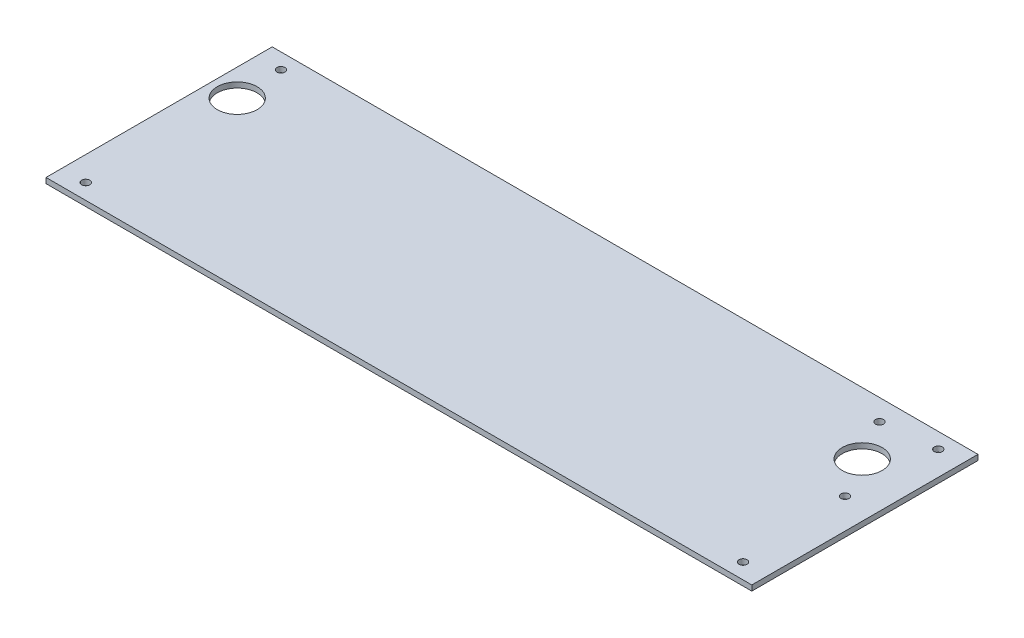
ISO-10303-21;
HEADER;
FILE_DESCRIPTION(('STEP AP214'),'2;1');
FILE_NAME('part.step','',(''),(''),'','','');
FILE_SCHEMA(('AUTOMOTIVE_DESIGN { 1 0 10303 214 1 1 1 1 }'));
ENDSEC;
DATA;
#1=APPLICATION_CONTEXT('core data for automotive mechanical design processes');
#2=APPLICATION_PROTOCOL_DEFINITION('international standard','automotive_design',2000,#1);
#3=PRODUCT_CONTEXT('',#1,'mechanical');
#4=PRODUCT('Part','Part','',(#3));
#5=PRODUCT_RELATED_PRODUCT_CATEGORY('part','',(#4));
#6=PRODUCT_DEFINITION_FORMATION('','',#4);
#7=PRODUCT_DEFINITION_CONTEXT('part definition',#1,'design');
#8=PRODUCT_DEFINITION('design','',#6,#7);
#9=PRODUCT_DEFINITION_SHAPE('','',#8);
#10=(LENGTH_UNIT() NAMED_UNIT(*) SI_UNIT(.MILLI.,.METRE.));
#11=(NAMED_UNIT(*) PLANE_ANGLE_UNIT() SI_UNIT($,.RADIAN.));
#12=(NAMED_UNIT(*) SI_UNIT($,.STERADIAN.) SOLID_ANGLE_UNIT());
#13=UNCERTAINTY_MEASURE_WITH_UNIT(LENGTH_MEASURE(1.E-05),#10,'distance_accuracy_value','');
#14=(GEOMETRIC_REPRESENTATION_CONTEXT(3) GLOBAL_UNCERTAINTY_ASSIGNED_CONTEXT((#13)) GLOBAL_UNIT_ASSIGNED_CONTEXT((#10,
#11,#12)) REPRESENTATION_CONTEXT('',''));
#15=CARTESIAN_POINT('',(0.,0.,0.));
#16=DIRECTION('',(0.,0.,1.));
#17=DIRECTION('',(1.,0.,0.));
#18=AXIS2_PLACEMENT_3D('',#15,#16,#17);
#19=CARTESIAN_POINT('',(-131.05,1.,42.));
#20=DIRECTION('',(1.,0.,0.));
#21=DIRECTION('',(0.,0.,-1.));
#22=AXIS2_PLACEMENT_3D('',#19,#20,#21);
#23=PLANE('',#22);
#24=DIRECTION('',(0.,0.,1.));
#25=VECTOR('',#24,1.);
#26=CARTESIAN_POINT('',(-131.05,-1.,42.));
#27=LINE('',#26,#25);
#28=CARTESIAN_POINT('',(-131.05,-1.,-42.));
#29=VERTEX_POINT('',#28);
#30=CARTESIAN_POINT('',(-131.05,-1.,42.));
#31=VERTEX_POINT('',#30);
#32=EDGE_CURVE('E101',#29,#31,#27,.T.);
#33=ORIENTED_EDGE('',*,*,#32,.T.);
#34=DIRECTION('',(0.,-1.,0.));
#35=VECTOR('',#34,1.);
#36=CARTESIAN_POINT('',(-131.05,1.,42.));
#37=LINE('',#36,#35);
#38=CARTESIAN_POINT('',(-131.05,1.,42.));
#39=VERTEX_POINT('',#38);
#40=EDGE_CURVE('E11',#39,#31,#37,.T.);
#41=ORIENTED_EDGE('',*,*,#40,.F.);
#42=DIRECTION('',(0.,0.,1.));
#43=VECTOR('',#42,1.);
#44=CARTESIAN_POINT('',(-131.05,1.,42.));
#45=LINE('',#44,#43);
#46=CARTESIAN_POINT('',(-131.05,1.,-42.));
#47=VERTEX_POINT('',#46);
#48=EDGE_CURVE('E88',#47,#39,#45,.T.);
#49=ORIENTED_EDGE('',*,*,#48,.F.);
#50=DIRECTION('',(0.,-1.,0.));
#51=VECTOR('',#50,1.);
#52=CARTESIAN_POINT('',(-131.05,1.,-42.));
#53=LINE('',#52,#51);
#54=EDGE_CURVE('E97',#47,#29,#53,.T.);
#55=ORIENTED_EDGE('',*,*,#54,.T.);
#56=EDGE_LOOP('',(#33,#41,#49,#55));
#57=FACE_BOUND('',#56,.T.);
#58=ADVANCED_FACE('F35',(#57),#23,.F.);
#59=CARTESIAN_POINT('',(131.05,1.,42.));
#60=DIRECTION('',(0.,0.,-1.));
#61=DIRECTION('',(-1.,0.,0.));
#62=AXIS2_PLACEMENT_3D('',#59,#60,#61);
#63=PLANE('',#62);
#64=DIRECTION('',(1.,0.,0.));
#65=VECTOR('',#64,1.);
#66=CARTESIAN_POINT('',(131.05,-1.,42.));
#67=LINE('',#66,#65);
#68=CARTESIAN_POINT('',(131.05,-1.,42.));
#69=VERTEX_POINT('',#68);
#70=EDGE_CURVE('E92',#31,#69,#67,.T.);
#71=ORIENTED_EDGE('',*,*,#70,.T.);
#72=DIRECTION('',(0.,-1.,0.));
#73=VECTOR('',#72,1.);
#74=CARTESIAN_POINT('',(131.05,1.,42.));
#75=LINE('',#74,#73);
#76=CARTESIAN_POINT('',(131.05,1.,42.));
#77=VERTEX_POINT('',#76);
#78=EDGE_CURVE('E44',#77,#69,#75,.T.);
#79=ORIENTED_EDGE('',*,*,#78,.F.);
#80=DIRECTION('',(1.,0.,0.));
#81=VECTOR('',#80,1.);
#82=CARTESIAN_POINT('',(131.05,1.,42.));
#83=LINE('',#82,#81);
#84=EDGE_CURVE('E83',#39,#77,#83,.T.);
#85=ORIENTED_EDGE('',*,*,#84,.F.);
#86=ORIENTED_EDGE('',*,*,#40,.T.);
#87=EDGE_LOOP('',(#71,#79,#85,#86));
#88=FACE_BOUND('',#87,.T.);
#89=ADVANCED_FACE('F91',(#88),#63,.F.);
#90=CARTESIAN_POINT('',(131.05,1.,42.));
#91=DIRECTION('',(-1.,0.,0.));
#92=DIRECTION('',(0.,0.,1.));
#93=AXIS2_PLACEMENT_3D('',#90,#91,#92);
#94=PLANE('',#93);
#95=DIRECTION('',(0.,0.,-1.));
#96=VECTOR('',#95,1.);
#97=CARTESIAN_POINT('',(131.05,-1.,42.));
#98=LINE('',#97,#96);
#99=CARTESIAN_POINT('',(131.05,-1.,-42.));
#100=VERTEX_POINT('',#99);
#101=EDGE_CURVE('E70',#69,#100,#98,.T.);
#102=ORIENTED_EDGE('',*,*,#101,.T.);
#103=DIRECTION('',(0.,-1.,0.));
#104=VECTOR('',#103,1.);
#105=CARTESIAN_POINT('',(131.05,1.,-42.));
#106=LINE('',#105,#104);
#107=CARTESIAN_POINT('',(131.05,1.,-42.));
#108=VERTEX_POINT('',#107);
#109=EDGE_CURVE('E93',#108,#100,#106,.T.);
#110=ORIENTED_EDGE('',*,*,#109,.F.);
#111=DIRECTION('',(0.,0.,-1.));
#112=VECTOR('',#111,1.);
#113=CARTESIAN_POINT('',(131.05,1.,42.));
#114=LINE('',#113,#112);
#115=EDGE_CURVE('E86',#77,#108,#114,.T.);
#116=ORIENTED_EDGE('',*,*,#115,.F.);
#117=ORIENTED_EDGE('',*,*,#78,.T.);
#118=EDGE_LOOP('',(#102,#110,#116,#117));
#119=FACE_BOUND('',#118,.T.);
#120=ADVANCED_FACE('F95',(#119),#94,.F.);
#121=CARTESIAN_POINT('',(131.05,1.,-42.));
#122=DIRECTION('',(0.,0.,1.));
#123=DIRECTION('',(1.,0.,0.));
#124=AXIS2_PLACEMENT_3D('',#121,#122,#123);
#125=PLANE('',#124);
#126=DIRECTION('',(-1.,0.,0.));
#127=VECTOR('',#126,1.);
#128=CARTESIAN_POINT('',(131.05,-1.,-42.));
#129=LINE('',#128,#127);
#130=EDGE_CURVE('E76',#100,#29,#129,.T.);
#131=ORIENTED_EDGE('',*,*,#130,.T.);
#132=ORIENTED_EDGE('',*,*,#54,.F.);
#133=DIRECTION('',(-1.,0.,0.));
#134=VECTOR('',#133,1.);
#135=CARTESIAN_POINT('',(131.05,1.,-42.));
#136=LINE('',#135,#134);
#137=EDGE_CURVE('E53',#108,#47,#136,.T.);
#138=ORIENTED_EDGE('',*,*,#137,.F.);
#139=ORIENTED_EDGE('',*,*,#109,.T.);
#140=EDGE_LOOP('',(#131,#132,#138,#139));
#141=FACE_BOUND('',#140,.T.);
#142=ADVANCED_FACE('F164',(#141),#125,.F.);
#143=CARTESIAN_POINT('',(0.,1.,0.));
#144=DIRECTION('',(0.,1.,0.));
#145=DIRECTION('',(0.,0.,1.));
#146=AXIS2_PLACEMENT_3D('',#143,#144,#145);
#147=PLANE('',#146);
#148=CARTESIAN_POINT('',(102.299999873491,1.,-34.1554450383656));
#149=DIRECTION('',(0.,1.,0.));
#150=DIRECTION('',(0.,0.,1.));
#151=AXIS2_PLACEMENT_3D('',#148,#149,#150);
#152=CIRCLE('',#151,1.49999999999992);
#153=CARTESIAN_POINT('',(102.299999873491,1.,-32.6554450383656));
#154=VERTEX_POINT('',#153);
#155=EDGE_CURVE('E123',#154,#154,#152,.T.);
#156=ORIENTED_EDGE('',*,*,#155,.F.);
#157=EDGE_LOOP('',(#156));
#158=FACE_BOUND('',#157,.T.);
#159=CARTESIAN_POINT('',(119.799998237946,1.,-3.8445549616281));
#160=DIRECTION('',(0.,1.,0.));
#161=DIRECTION('',(0.,0.,1.));
#162=AXIS2_PLACEMENT_3D('',#159,#160,#161);
#163=CIRCLE('',#162,1.5);
#164=CARTESIAN_POINT('',(119.799998237946,1.,-2.3445549616281));
#165=VERTEX_POINT('',#164);
#166=EDGE_CURVE('E129',#165,#165,#163,.T.);
#167=ORIENTED_EDGE('',*,*,#166,.F.);
#168=EDGE_LOOP('',(#167));
#169=FACE_BOUND('',#168,.T.);
#170=CARTESIAN_POINT('',(-121.050000944283,1.,-18.9999999999974));
#171=DIRECTION('',(0.,1.,0.));
#172=DIRECTION('',(0.,0.,1.));
#173=AXIS2_PLACEMENT_3D('',#170,#171,#172);
#174=CIRCLE('',#173,7.4);
#175=CARTESIAN_POINT('',(-121.050000944283,1.,-11.5999999999974));
#176=VERTEX_POINT('',#175);
#177=EDGE_CURVE('E140',#176,#176,#174,.T.);
#178=ORIENTED_EDGE('',*,*,#177,.F.);
#179=EDGE_LOOP('',(#178));
#180=FACE_BOUND('',#179,.T.);
#181=CARTESIAN_POINT('',(111.049999055719,1.,-18.9999999999974));
#182=DIRECTION('',(0.,1.,0.));
#183=DIRECTION('',(0.,0.,1.));
#184=AXIS2_PLACEMENT_3D('',#181,#182,#183);
#185=CIRCLE('',#184,7.4);
#186=CARTESIAN_POINT('',(111.049999055719,1.,-11.5999999999974));
#187=VERTEX_POINT('',#186);
#188=EDGE_CURVE('E127',#187,#187,#185,.T.);
#189=ORIENTED_EDGE('',*,*,#188,.F.);
#190=EDGE_LOOP('',(#189));
#191=FACE_BOUND('',#190,.T.);
#192=CARTESIAN_POINT('',(122.05,1.,-36.25));
#193=DIRECTION('',(0.,1.,0.));
#194=DIRECTION('',(0.,0.,1.));
#195=AXIS2_PLACEMENT_3D('',#192,#193,#194);
#196=CIRCLE('',#195,1.5);
#197=CARTESIAN_POINT('',(122.05,1.,-34.75));
#198=VERTEX_POINT('',#197);
#199=EDGE_CURVE('E139',#198,#198,#196,.T.);
#200=ORIENTED_EDGE('',*,*,#199,.F.);
#201=EDGE_LOOP('',(#200));
#202=FACE_BOUND('',#201,.T.);
#203=CARTESIAN_POINT('',(122.05,1.,36.25));
#204=DIRECTION('',(0.,1.,0.));
#205=DIRECTION('',(0.,0.,1.));
#206=AXIS2_PLACEMENT_3D('',#203,#204,#205);
#207=CIRCLE('',#206,1.5);
#208=CARTESIAN_POINT('',(122.05,1.,37.75));
#209=VERTEX_POINT('',#208);
#210=EDGE_CURVE('E151',#209,#209,#207,.T.);
#211=ORIENTED_EDGE('',*,*,#210,.F.);
#212=EDGE_LOOP('',(#211));
#213=FACE_BOUND('',#212,.T.);
#214=CARTESIAN_POINT('',(-122.05,1.,36.25));
#215=DIRECTION('',(0.,1.,0.));
#216=DIRECTION('',(0.,0.,1.));
#217=AXIS2_PLACEMENT_3D('',#214,#215,#216);
#218=CIRCLE('',#217,1.5);
#219=CARTESIAN_POINT('',(-122.05,1.,37.75));
#220=VERTEX_POINT('',#219);
#221=EDGE_CURVE('E148',#220,#220,#218,.T.);
#222=ORIENTED_EDGE('',*,*,#221,.F.);
#223=EDGE_LOOP('',(#222));
#224=FACE_BOUND('',#223,.T.);
#225=CARTESIAN_POINT('',(-122.05,1.,-36.25));
#226=DIRECTION('',(0.,1.,0.));
#227=DIRECTION('',(0.,0.,1.));
#228=AXIS2_PLACEMENT_3D('',#225,#226,#227);
#229=CIRCLE('',#228,1.5);
#230=CARTESIAN_POINT('',(-122.05,1.,-34.75));
#231=VERTEX_POINT('',#230);
#232=EDGE_CURVE('E114',#231,#231,#229,.T.);
#233=ORIENTED_EDGE('',*,*,#232,.F.);
#234=EDGE_LOOP('',(#233));
#235=FACE_BOUND('',#234,.T.);
#236=ORIENTED_EDGE('',*,*,#48,.T.);
#237=ORIENTED_EDGE('',*,*,#84,.T.);
#238=ORIENTED_EDGE('',*,*,#115,.T.);
#239=ORIENTED_EDGE('',*,*,#137,.T.);
#240=EDGE_LOOP('',(#236,#237,#238,#239));
#241=FACE_BOUND('',#240,.T.);
#242=ADVANCED_FACE('F84',(#158,#169,#180,#191,#202,#213,#224,#235,#241),#147,.T.);
#243=CARTESIAN_POINT('',(0.,-1.,0.));
#244=DIRECTION('',(0.,1.,0.));
#245=DIRECTION('',(0.,0.,1.));
#246=AXIS2_PLACEMENT_3D('',#243,#244,#245);
#247=PLANE('',#246);
#248=CARTESIAN_POINT('',(102.299999873491,-1.,-34.1554450383656));
#249=DIRECTION('',(0.,1.,0.));
#250=DIRECTION('',(0.,0.,1.));
#251=AXIS2_PLACEMENT_3D('',#248,#249,#250);
#252=CIRCLE('',#251,1.49999999999992);
#253=CARTESIAN_POINT('',(102.299999873491,-1.,-32.6554450383656));
#254=VERTEX_POINT('',#253);
#255=EDGE_CURVE('E38',#254,#254,#252,.T.);
#256=ORIENTED_EDGE('',*,*,#255,.T.);
#257=EDGE_LOOP('',(#256));
#258=FACE_BOUND('',#257,.T.);
#259=CARTESIAN_POINT('',(119.799998237946,-1.,-3.8445549616281));
#260=DIRECTION('',(0.,1.,0.));
#261=DIRECTION('',(0.,0.,1.));
#262=AXIS2_PLACEMENT_3D('',#259,#260,#261);
#263=CIRCLE('',#262,1.5);
#264=CARTESIAN_POINT('',(119.799998237946,-1.,-2.3445549616281));
#265=VERTEX_POINT('',#264);
#266=EDGE_CURVE('E121',#265,#265,#263,.T.);
#267=ORIENTED_EDGE('',*,*,#266,.T.);
#268=EDGE_LOOP('',(#267));
#269=FACE_BOUND('',#268,.T.);
#270=CARTESIAN_POINT('',(-121.050000944283,-1.,-18.9999999999974));
#271=DIRECTION('',(0.,1.,0.));
#272=DIRECTION('',(0.,0.,1.));
#273=AXIS2_PLACEMENT_3D('',#270,#271,#272);
#274=CIRCLE('',#273,7.4);
#275=CARTESIAN_POINT('',(-121.050000944283,-1.,-11.5999999999974));
#276=VERTEX_POINT('',#275);
#277=EDGE_CURVE('E136',#276,#276,#274,.T.);
#278=ORIENTED_EDGE('',*,*,#277,.T.);
#279=EDGE_LOOP('',(#278));
#280=FACE_BOUND('',#279,.T.);
#281=CARTESIAN_POINT('',(111.049999055719,-1.,-18.9999999999974));
#282=DIRECTION('',(0.,1.,0.));
#283=DIRECTION('',(0.,0.,1.));
#284=AXIS2_PLACEMENT_3D('',#281,#282,#283);
#285=CIRCLE('',#284,7.4);
#286=CARTESIAN_POINT('',(111.049999055719,-1.,-11.5999999999974));
#287=VERTEX_POINT('',#286);
#288=EDGE_CURVE('E143',#287,#287,#285,.T.);
#289=ORIENTED_EDGE('',*,*,#288,.T.);
#290=EDGE_LOOP('',(#289));
#291=FACE_BOUND('',#290,.T.);
#292=CARTESIAN_POINT('',(122.05,-1.,-36.25));
#293=DIRECTION('',(0.,1.,0.));
#294=DIRECTION('',(0.,0.,1.));
#295=AXIS2_PLACEMENT_3D('',#292,#293,#294);
#296=CIRCLE('',#295,1.5);
#297=CARTESIAN_POINT('',(122.05,-1.,-34.75));
#298=VERTEX_POINT('',#297);
#299=EDGE_CURVE('E104',#298,#298,#296,.T.);
#300=ORIENTED_EDGE('',*,*,#299,.T.);
#301=EDGE_LOOP('',(#300));
#302=FACE_BOUND('',#301,.T.);
#303=CARTESIAN_POINT('',(122.05,-1.,36.25));
#304=DIRECTION('',(0.,1.,0.));
#305=DIRECTION('',(0.,0.,1.));
#306=AXIS2_PLACEMENT_3D('',#303,#304,#305);
#307=CIRCLE('',#306,1.5);
#308=CARTESIAN_POINT('',(122.05,-1.,37.75));
#309=VERTEX_POINT('',#308);
#310=EDGE_CURVE('E117',#309,#309,#307,.T.);
#311=ORIENTED_EDGE('',*,*,#310,.T.);
#312=EDGE_LOOP('',(#311));
#313=FACE_BOUND('',#312,.T.);
#314=CARTESIAN_POINT('',(-122.05,-1.,36.25));
#315=DIRECTION('',(0.,1.,0.));
#316=DIRECTION('',(0.,0.,1.));
#317=AXIS2_PLACEMENT_3D('',#314,#315,#316);
#318=CIRCLE('',#317,1.5);
#319=CARTESIAN_POINT('',(-122.05,-1.,37.75));
#320=VERTEX_POINT('',#319);
#321=EDGE_CURVE('E113',#320,#320,#318,.T.);
#322=ORIENTED_EDGE('',*,*,#321,.T.);
#323=EDGE_LOOP('',(#322));
#324=FACE_BOUND('',#323,.T.);
#325=CARTESIAN_POINT('',(-122.05,-1.,-36.25));
#326=DIRECTION('',(0.,1.,0.));
#327=DIRECTION('',(0.,0.,1.));
#328=AXIS2_PLACEMENT_3D('',#325,#326,#327);
#329=CIRCLE('',#328,1.5);
#330=CARTESIAN_POINT('',(-122.05,-1.,-34.75));
#331=VERTEX_POINT('',#330);
#332=EDGE_CURVE('E110',#331,#331,#329,.T.);
#333=ORIENTED_EDGE('',*,*,#332,.T.);
#334=EDGE_LOOP('',(#333));
#335=FACE_BOUND('',#334,.T.);
#336=ORIENTED_EDGE('',*,*,#32,.F.);
#337=ORIENTED_EDGE('',*,*,#130,.F.);
#338=ORIENTED_EDGE('',*,*,#101,.F.);
#339=ORIENTED_EDGE('',*,*,#70,.F.);
#340=EDGE_LOOP('',(#336,#337,#338,#339));
#341=FACE_BOUND('',#340,.T.);
#342=ADVANCED_FACE('F163',(#258,#269,#280,#291,#302,#313,#324,#335,#341),#247,.F.);
#343=CARTESIAN_POINT('',(-122.05,-9.,-36.25));
#344=DIRECTION('',(0.,1.,0.));
#345=DIRECTION('',(0.,0.,1.));
#346=AXIS2_PLACEMENT_3D('',#343,#344,#345);
#347=CYLINDRICAL_SURFACE('',#346,1.5);
#348=ORIENTED_EDGE('',*,*,#232,.T.);
#349=EDGE_LOOP('',(#348));
#350=FACE_BOUND('',#349,.T.);
#351=ORIENTED_EDGE('',*,*,#332,.F.);
#352=EDGE_LOOP('',(#351));
#353=FACE_BOUND('',#352,.T.);
#354=ADVANCED_FACE('F159',(#350,#353),#347,.F.);
#355=CARTESIAN_POINT('',(-122.05,-9.,36.25));
#356=DIRECTION('',(0.,1.,0.));
#357=DIRECTION('',(0.,0.,1.));
#358=AXIS2_PLACEMENT_3D('',#355,#356,#357);
#359=CYLINDRICAL_SURFACE('',#358,1.5);
#360=ORIENTED_EDGE('',*,*,#221,.T.);
#361=EDGE_LOOP('',(#360));
#362=FACE_BOUND('',#361,.T.);
#363=ORIENTED_EDGE('',*,*,#321,.F.);
#364=EDGE_LOOP('',(#363));
#365=FACE_BOUND('',#364,.T.);
#366=ADVANCED_FACE('F203',(#362,#365),#359,.F.);
#367=CARTESIAN_POINT('',(122.05,-9.,36.25));
#368=DIRECTION('',(0.,1.,0.));
#369=DIRECTION('',(0.,0.,1.));
#370=AXIS2_PLACEMENT_3D('',#367,#368,#369);
#371=CYLINDRICAL_SURFACE('',#370,1.5);
#372=ORIENTED_EDGE('',*,*,#210,.T.);
#373=EDGE_LOOP('',(#372));
#374=FACE_BOUND('',#373,.T.);
#375=ORIENTED_EDGE('',*,*,#310,.F.);
#376=EDGE_LOOP('',(#375));
#377=FACE_BOUND('',#376,.T.);
#378=ADVANCED_FACE('F212',(#374,#377),#371,.F.);
#379=CARTESIAN_POINT('',(122.05,-9.,-36.25));
#380=DIRECTION('',(0.,1.,0.));
#381=DIRECTION('',(0.,0.,1.));
#382=AXIS2_PLACEMENT_3D('',#379,#380,#381);
#383=CYLINDRICAL_SURFACE('',#382,1.5);
#384=ORIENTED_EDGE('',*,*,#199,.T.);
#385=EDGE_LOOP('',(#384));
#386=FACE_BOUND('',#385,.T.);
#387=ORIENTED_EDGE('',*,*,#299,.F.);
#388=EDGE_LOOP('',(#387));
#389=FACE_BOUND('',#388,.T.);
#390=ADVANCED_FACE('F222',(#386,#389),#383,.F.);
#391=CARTESIAN_POINT('',(111.049999055719,-1.,-18.9999999999974));
#392=DIRECTION('',(0.,1.,0.));
#393=DIRECTION('',(0.,0.,1.));
#394=AXIS2_PLACEMENT_3D('',#391,#392,#393);
#395=CYLINDRICAL_SURFACE('',#394,7.4);
#396=ORIENTED_EDGE('',*,*,#288,.F.);
#397=EDGE_LOOP('',(#396));
#398=FACE_BOUND('',#397,.T.);
#399=ORIENTED_EDGE('',*,*,#188,.T.);
#400=EDGE_LOOP('',(#399));
#401=FACE_BOUND('',#400,.T.);
#402=ADVANCED_FACE('F232',(#398,#401),#395,.F.);
#403=CARTESIAN_POINT('',(-121.050000944283,-1.,-18.9999999999974));
#404=DIRECTION('',(0.,1.,0.));
#405=DIRECTION('',(0.,0.,1.));
#406=AXIS2_PLACEMENT_3D('',#403,#404,#405);
#407=CYLINDRICAL_SURFACE('',#406,7.4);
#408=ORIENTED_EDGE('',*,*,#277,.F.);
#409=EDGE_LOOP('',(#408));
#410=FACE_BOUND('',#409,.T.);
#411=ORIENTED_EDGE('',*,*,#177,.T.);
#412=EDGE_LOOP('',(#411));
#413=FACE_BOUND('',#412,.T.);
#414=ADVANCED_FACE('F242',(#410,#413),#407,.F.);
#415=CARTESIAN_POINT('',(119.799998237946,-9.,-3.8445549616281));
#416=DIRECTION('',(0.,1.,0.));
#417=DIRECTION('',(0.,0.,1.));
#418=AXIS2_PLACEMENT_3D('',#415,#416,#417);
#419=CYLINDRICAL_SURFACE('',#418,1.5);
#420=ORIENTED_EDGE('',*,*,#166,.T.);
#421=EDGE_LOOP('',(#420));
#422=FACE_BOUND('',#421,.T.);
#423=ORIENTED_EDGE('',*,*,#266,.F.);
#424=EDGE_LOOP('',(#423));
#425=FACE_BOUND('',#424,.T.);
#426=ADVANCED_FACE('F251',(#422,#425),#419,.F.);
#427=CARTESIAN_POINT('',(102.299999873491,-9.,-34.1554450383656));
#428=DIRECTION('',(0.,1.,0.));
#429=DIRECTION('',(0.,0.,1.));
#430=AXIS2_PLACEMENT_3D('',#427,#428,#429);
#431=CYLINDRICAL_SURFACE('',#430,1.49999999999992);
#432=ORIENTED_EDGE('',*,*,#155,.T.);
#433=EDGE_LOOP('',(#432));
#434=FACE_BOUND('',#433,.T.);
#435=ORIENTED_EDGE('',*,*,#255,.F.);
#436=EDGE_LOOP('',(#435));
#437=FACE_BOUND('',#436,.T.);
#438=ADVANCED_FACE('F270',(#434,#437),#431,.F.);
#439=CLOSED_SHELL('',(#58,#89,#120,#142,#242,#342,#354,#366,#378,#390,#402,#414,#426,#438));
#440=MANIFOLD_SOLID_BREP('B2',#439);
#441=ADVANCED_BREP_SHAPE_REPRESENTATION('',(#18,#440),#14);
#442=SHAPE_DEFINITION_REPRESENTATION(#9,#441);
ENDSEC;
END-ISO-10303-21;
